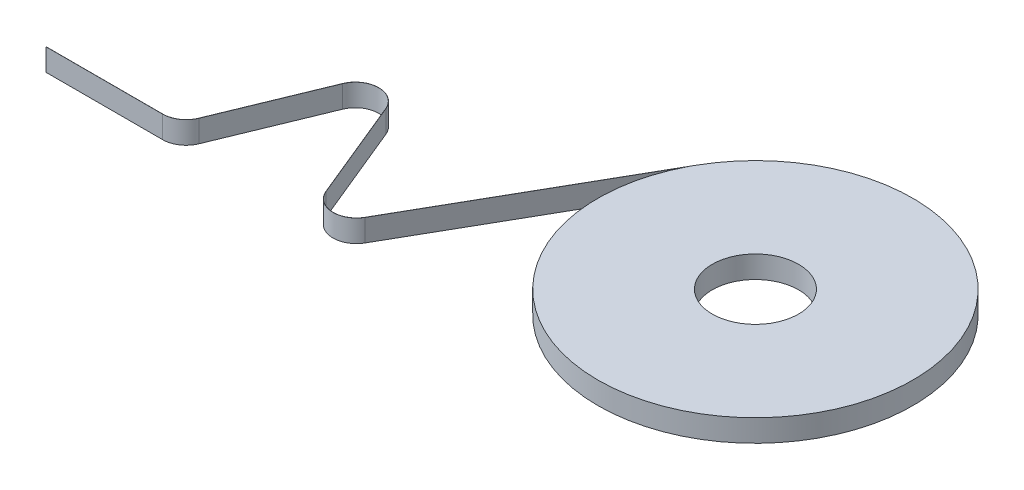
ISO-10303-21;
HEADER;
FILE_DESCRIPTION(('STEP AP214'),'2;1');
FILE_NAME('part.step','',(''),(''),'','','');
FILE_SCHEMA(('AUTOMOTIVE_DESIGN { 1 0 10303 214 1 1 1 1 }'));
ENDSEC;
DATA;
#1=APPLICATION_CONTEXT('core data for automotive mechanical design processes');
#2=APPLICATION_PROTOCOL_DEFINITION('international standard','automotive_design',2000,#1);
#3=PRODUCT_CONTEXT('',#1,'mechanical');
#4=PRODUCT('Part','Part','',(#3));
#5=PRODUCT_RELATED_PRODUCT_CATEGORY('part','',(#4));
#6=PRODUCT_DEFINITION_FORMATION('','',#4);
#7=PRODUCT_DEFINITION_CONTEXT('part definition',#1,'design');
#8=PRODUCT_DEFINITION('design','',#6,#7);
#9=PRODUCT_DEFINITION_SHAPE('','',#8);
#10=(LENGTH_UNIT() NAMED_UNIT(*) SI_UNIT(.MILLI.,.METRE.));
#11=(NAMED_UNIT(*) PLANE_ANGLE_UNIT() SI_UNIT($,.RADIAN.));
#12=(NAMED_UNIT(*) SI_UNIT($,.STERADIAN.) SOLID_ANGLE_UNIT());
#13=UNCERTAINTY_MEASURE_WITH_UNIT(LENGTH_MEASURE(1.E-05),#10,'distance_accuracy_value','');
#14=(GEOMETRIC_REPRESENTATION_CONTEXT(3) GLOBAL_UNCERTAINTY_ASSIGNED_CONTEXT((#13)) GLOBAL_UNIT_ASSIGNED_CONTEXT((#10,
#11,#12)) REPRESENTATION_CONTEXT('',''));
#15=CARTESIAN_POINT('',(0.,0.,0.));
#16=DIRECTION('',(0.,0.,1.));
#17=DIRECTION('',(1.,0.,0.));
#18=AXIS2_PLACEMENT_3D('',#15,#16,#17);
#19=CARTESIAN_POINT('',(-484.,0.,124.));
#20=DIRECTION('',(-1.,0.,0.));
#21=DIRECTION('',(0.,0.,1.));
#22=AXIS2_PLACEMENT_3D('',#19,#20,#21);
#23=PLANE('',#22);
#24=DIRECTION('',(0.,1.,0.));
#25=VECTOR('',#24,1.);
#26=CARTESIAN_POINT('',(-484.,0.,124.1));
#27=LINE('',#26,#25);
#28=CARTESIAN_POINT('',(-484.,0.,124.1));
#29=VERTEX_POINT('',#28);
#30=CARTESIAN_POINT('',(-484.,19.,124.1));
#31=VERTEX_POINT('',#30);
#32=EDGE_CURVE('E164',#29,#31,#27,.T.);
#33=ORIENTED_EDGE('',*,*,#32,.T.);
#34=DIRECTION('',(0.,0.,1.));
#35=VECTOR('',#34,1.);
#36=CARTESIAN_POINT('',(-484.,19.,0.));
#37=LINE('',#36,#35);
#38=CARTESIAN_POINT('',(-484.,19.,124.));
#39=VERTEX_POINT('',#38);
#40=EDGE_CURVE('E149',#39,#31,#37,.T.);
#41=ORIENTED_EDGE('',*,*,#40,.F.);
#42=DIRECTION('',(0.,1.,0.));
#43=VECTOR('',#42,1.);
#44=CARTESIAN_POINT('',(-484.,0.,124.));
#45=LINE('',#44,#43);
#46=CARTESIAN_POINT('',(-484.,0.,124.));
#47=VERTEX_POINT('',#46);
#48=EDGE_CURVE('E179',#47,#39,#45,.T.);
#49=ORIENTED_EDGE('',*,*,#48,.F.);
#50=DIRECTION('',(0.,0.,1.));
#51=VECTOR('',#50,1.);
#52=CARTESIAN_POINT('',(-484.,0.,124.));
#53=LINE('',#52,#51);
#54=EDGE_CURVE('E169',#47,#29,#53,.T.);
#55=ORIENTED_EDGE('',*,*,#54,.T.);
#56=EDGE_LOOP('',(#33,#41,#49,#55));
#57=FACE_BOUND('',#56,.T.);
#58=ADVANCED_FACE('F18',(#57),#23,.T.);
#59=CARTESIAN_POINT('',(0.,19.,0.));
#60=DIRECTION('',(0.,1.,0.));
#61=DIRECTION('',(0.,0.,1.));
#62=AXIS2_PLACEMENT_3D('',#59,#60,#61);
#63=PLANE('',#62);
#64=CARTESIAN_POINT('',(0.,19.,0.));
#65=DIRECTION('',(0.,-1.,0.));
#66=DIRECTION('',(0.,0.,-1.));
#67=AXIS2_PLACEMENT_3D('',#64,#65,#66);
#68=CIRCLE('',#67,37.);
#69=CARTESIAN_POINT('',(0.,19.,-37.));
#70=VERTEX_POINT('',#69);
#71=EDGE_CURVE('E212',#70,#70,#68,.T.);
#72=ORIENTED_EDGE('',*,*,#71,.T.);
#73=EDGE_LOOP('',(#72));
#74=FACE_BOUND('',#73,.T.);
#75=DIRECTION('',(-0.496319822885845,0.,0.868139754538728));
#76=VECTOR('',#75,1.);
#77=CARTESIAN_POINT('',(-117.112052887,19.,-66.9535441074));
#78=LINE('',#77,#76);
#79=CARTESIAN_POINT('',(-220.550390933557,19.,113.976028440191));
#80=VERTEX_POINT('',#79);
#81=CARTESIAN_POINT('',(-119.6905287103,19.,-62.4433930616273));
#82=VERTEX_POINT('',#81);
#83=EDGE_CURVE('E150',#80,#82,#78,.F.);
#84=ORIENTED_EDGE('',*,*,#83,.T.);
#85=CARTESIAN_POINT('',(0.,19.,0.));
#86=DIRECTION('',(0.,1.,0.));
#87=DIRECTION('',(0.,0.,1.));
#88=AXIS2_PLACEMENT_3D('',#85,#86,#87);
#89=CIRCLE('',#88,135.);
#90=CARTESIAN_POINT('',(-117.198866862864,19.,-67.0031760895945));
#91=VERTEX_POINT('',#90);
#92=EDGE_CURVE('E216',#91,#82,#89,.F.);
#93=ORIENTED_EDGE('',*,*,#92,.F.);
#94=DIRECTION('',(-0.496319822885845,0.,0.868139754538728));
#95=VECTOR('',#94,1.);
#96=CARTESIAN_POINT('',(-117.198866863,19.,-67.0031760896));
#97=LINE('',#96,#95);
#98=CARTESIAN_POINT('',(-220.637204909325,19.,113.926396457737));
#99=VERTEX_POINT('',#98);
#100=EDGE_CURVE('E120',#99,#91,#97,.F.);
#101=ORIENTED_EDGE('',*,*,#100,.F.);
#102=CARTESIAN_POINT('',(-238.,19.,104.));
#103=DIRECTION('',(0.,1.,0.));
#104=DIRECTION('',(0.,0.,1.));
#105=AXIS2_PLACEMENT_3D('',#102,#103,#104);
#106=CIRCLE('',#105,20.);
#107=CARTESIAN_POINT('',(-256.496103457938,19.,111.608820991151));
#108=VERTEX_POINT('',#107);
#109=EDGE_CURVE('E21',#99,#108,#106,.F.);
#110=ORIENTED_EDGE('',*,*,#109,.T.);
#111=DIRECTION('',(-0.380441049564131,0.,-0.924805172891319));
#112=VECTOR('',#111,1.);
#113=CARTESIAN_POINT('',(-256.496103458,19.,111.608820991));
#114=LINE('',#113,#112);
#115=CARTESIAN_POINT('',(-292.411416024924,19.,24.303134903773));
#116=VERTEX_POINT('',#115);
#117=EDGE_CURVE('E125',#116,#108,#114,.F.);
#118=ORIENTED_EDGE('',*,*,#117,.F.);
#119=CARTESIAN_POINT('',(-311.,19.,31.95));
#120=DIRECTION('',(0.,1.,0.));
#121=DIRECTION('',(0.,0.,1.));
#122=AXIS2_PLACEMENT_3D('',#119,#120,#121);
#123=CIRCLE('',#122,20.1);
#124=CARTESIAN_POINT('',(-329.588583975002,19.,24.3031349038036));
#125=VERTEX_POINT('',#124);
#126=EDGE_CURVE('E228',#125,#116,#123,.F.);
#127=ORIENTED_EDGE('',*,*,#126,.F.);
#128=DIRECTION('',(-0.380441049564131,0.,0.924805172891319));
#129=VECTOR('',#128,1.);
#130=CARTESIAN_POINT('',(-329.588583975,19.,24.3031349038));
#131=LINE('',#130,#129);
#132=CARTESIAN_POINT('',(-365.503896542069,19.,111.608820991149));
#133=VERTEX_POINT('',#132);
#134=EDGE_CURVE('E182',#133,#125,#131,.F.);
#135=ORIENTED_EDGE('',*,*,#134,.F.);
#136=CARTESIAN_POINT('',(-384.,19.,104.));
#137=DIRECTION('',(0.,1.,0.));
#138=DIRECTION('',(0.,0.,1.));
#139=AXIS2_PLACEMENT_3D('',#136,#137,#138);
#140=CIRCLE('',#139,20.);
#141=CARTESIAN_POINT('',(-384.,19.,124.));
#142=VERTEX_POINT('',#141);
#143=EDGE_CURVE('E226',#133,#142,#140,.F.);
#144=ORIENTED_EDGE('',*,*,#143,.T.);
#145=DIRECTION('',(-1.,0.,0.));
#146=VECTOR('',#145,1.);
#147=CARTESIAN_POINT('',(-384.,19.,124.));
#148=LINE('',#147,#146);
#149=EDGE_CURVE('E176',#39,#142,#148,.F.);
#150=ORIENTED_EDGE('',*,*,#149,.F.);
#151=ORIENTED_EDGE('',*,*,#40,.T.);
#152=DIRECTION('',(-1.,0.,0.));
#153=VECTOR('',#152,1.);
#154=CARTESIAN_POINT('',(-384.,19.,124.1));
#155=LINE('',#154,#153);
#156=CARTESIAN_POINT('',(-384.,19.,124.1));
#157=VERTEX_POINT('',#156);
#158=EDGE_CURVE('E161',#31,#157,#155,.F.);
#159=ORIENTED_EDGE('',*,*,#158,.T.);
#160=CARTESIAN_POINT('',(-384.,19.,104.));
#161=DIRECTION('',(0.,1.,0.));
#162=DIRECTION('',(0.,0.,1.));
#163=AXIS2_PLACEMENT_3D('',#160,#161,#162);
#164=CIRCLE('',#163,20.1);
#165=CARTESIAN_POINT('',(-365.411416025033,19.,111.646865096082));
#166=VERTEX_POINT('',#165);
#167=EDGE_CURVE('E223',#166,#157,#164,.F.);
#168=ORIENTED_EDGE('',*,*,#167,.F.);
#169=DIRECTION('',(-0.380441049564131,0.,0.924805172891319));
#170=VECTOR('',#169,1.);
#171=CARTESIAN_POINT('',(-329.496103458,19.,24.3411790087));
#172=LINE('',#171,#170);
#173=CARTESIAN_POINT('',(-329.496103457913,19.,24.3411790087087));
#174=VERTEX_POINT('',#173);
#175=EDGE_CURVE('E157',#166,#174,#172,.F.);
#176=ORIENTED_EDGE('',*,*,#175,.T.);
#177=CARTESIAN_POINT('',(-311.,19.,31.95));
#178=DIRECTION('',(0.,1.,0.));
#179=DIRECTION('',(0.,0.,1.));
#180=AXIS2_PLACEMENT_3D('',#177,#178,#179);
#181=CIRCLE('',#180,20.);
#182=CARTESIAN_POINT('',(-292.503896542008,19.,24.3411790086764));
#183=VERTEX_POINT('',#182);
#184=EDGE_CURVE('E221',#174,#183,#181,.F.);
#185=ORIENTED_EDGE('',*,*,#184,.T.);
#186=DIRECTION('',(-0.380441049564131,0.,-0.924805172891319));
#187=VECTOR('',#186,1.);
#188=CARTESIAN_POINT('',(-256.588583975,19.,111.646865096));
#189=LINE('',#188,#187);
#190=CARTESIAN_POINT('',(-256.588583975058,19.,111.64686509612));
#191=VERTEX_POINT('',#190);
#192=EDGE_CURVE('E153',#183,#191,#189,.F.);
#193=ORIENTED_EDGE('',*,*,#192,.T.);
#194=CARTESIAN_POINT('',(-238.,19.,104.));
#195=DIRECTION('',(0.,1.,0.));
#196=DIRECTION('',(0.,0.,1.));
#197=AXIS2_PLACEMENT_3D('',#194,#195,#196);
#198=CIRCLE('',#197,20.1);
#199=EDGE_CURVE('E218',#80,#191,#198,.F.);
#200=ORIENTED_EDGE('',*,*,#199,.F.);
#201=EDGE_LOOP('',(#84,#93,#101,#110,#118,#127,#135,#144,#150,#151,#159,#168,#176,#185,#193,#200));
#202=FACE_BOUND('',#201,.T.);
#203=ADVANCED_FACE('F124',(#74,#202),#63,.T.);
#204=CARTESIAN_POINT('',(-117.198866863,0.,-67.0031760896));
#205=DIRECTION('',(-0.868139754538728,0.,-0.496319822885845));
#206=DIRECTION('',(-0.496319822885845,0.,0.868139754538728));
#207=AXIS2_PLACEMENT_3D('',#204,#205,#206);
#208=PLANE('',#207);
#209=DIRECTION('',(0.,1.,0.));
#210=VECTOR('',#209,1.);
#211=CARTESIAN_POINT('',(-220.637204909292,9.5,113.926396457833));
#212=LINE('',#211,#210);
#213=CARTESIAN_POINT('',(-220.637204909101,0.,113.926396457838));
#214=VERTEX_POINT('',#213);
#215=EDGE_CURVE('E131',#214,#99,#212,.T.);
#216=ORIENTED_EDGE('',*,*,#215,.T.);
#217=ORIENTED_EDGE('',*,*,#100,.T.);
#218=DIRECTION('',(0.,1.,0.));
#219=VECTOR('',#218,1.);
#220=CARTESIAN_POINT('',(-117.198866862791,9.5,-67.0031760894803));
#221=LINE('',#220,#219);
#222=CARTESIAN_POINT('',(-117.198866862943,0.,-67.0031760894573));
#223=VERTEX_POINT('',#222);
#224=EDGE_CURVE('E215',#223,#91,#221,.T.);
#225=ORIENTED_EDGE('',*,*,#224,.F.);
#226=DIRECTION('',(-0.496319822883812,0.,0.868139754539891));
#227=VECTOR('',#226,1.);
#228=CARTESIAN_POINT('',(-117.198866863,0.,-67.0031760896));
#229=LINE('',#228,#227);
#230=EDGE_CURVE('E211',#223,#214,#229,.T.);
#231=ORIENTED_EDGE('',*,*,#230,.T.);
#232=EDGE_LOOP('',(#216,#217,#225,#231));
#233=FACE_BOUND('',#232,.T.);
#234=ADVANCED_FACE('F462',(#233),#208,.T.);
#235=CARTESIAN_POINT('',(-238.,9.5,104.));
#236=DIRECTION('',(0.,1.,0.));
#237=DIRECTION('',(0.,0.,1.));
#238=AXIS2_PLACEMENT_3D('',#235,#236,#237);
#239=CYLINDRICAL_SURFACE('',#238,20.);
#240=ORIENTED_EDGE('',*,*,#215,.F.);
#241=CARTESIAN_POINT('',(-238.,0.,104.));
#242=DIRECTION('',(0.,1.,0.));
#243=DIRECTION('',(0.,0.,1.));
#244=AXIS2_PLACEMENT_3D('',#241,#242,#243);
#245=CIRCLE('',#244,20.);
#246=CARTESIAN_POINT('',(-256.496103457936,0.,111.608820991155));
#247=VERTEX_POINT('',#246);
#248=EDGE_CURVE('E142',#214,#247,#245,.F.);
#249=ORIENTED_EDGE('',*,*,#248,.T.);
#250=DIRECTION('',(0.,1.,0.));
#251=VECTOR('',#250,1.);
#252=CARTESIAN_POINT('',(-256.496103458,0.,111.608820991));
#253=LINE('',#252,#251);
#254=EDGE_CURVE('E130',#108,#247,#253,.F.);
#255=ORIENTED_EDGE('',*,*,#254,.F.);
#256=ORIENTED_EDGE('',*,*,#109,.F.);
#257=EDGE_LOOP('',(#240,#249,#255,#256));
#258=FACE_BOUND('',#257,.T.);
#259=ADVANCED_FACE('F140',(#258),#239,.F.);
#260=CARTESIAN_POINT('',(-256.496103458,0.,111.608820991));
#261=DIRECTION('',(0.924805172891319,0.,-0.380441049564131));
#262=DIRECTION('',(-0.380441049564131,0.,-0.924805172891319));
#263=AXIS2_PLACEMENT_3D('',#260,#261,#262);
#264=PLANE('',#263);
#265=DIRECTION('',(0.,1.,0.));
#266=VECTOR('',#265,1.);
#267=CARTESIAN_POINT('',(-292.411416024887,9.5,24.3031349037537));
#268=LINE('',#267,#266);
#269=CARTESIAN_POINT('',(-292.411416024944,0.,24.3031349037766));
#270=VERTEX_POINT('',#269);
#271=EDGE_CURVE('E137',#116,#270,#268,.F.);
#272=ORIENTED_EDGE('',*,*,#271,.F.);
#273=ORIENTED_EDGE('',*,*,#117,.T.);
#274=ORIENTED_EDGE('',*,*,#254,.T.);
#275=DIRECTION('',(-0.380441049564516,0.,-0.924805172891161));
#276=VECTOR('',#275,1.);
#277=CARTESIAN_POINT('',(-256.496103458,0.,111.608820991));
#278=LINE('',#277,#276);
#279=EDGE_CURVE('E209',#247,#270,#278,.T.);
#280=ORIENTED_EDGE('',*,*,#279,.T.);
#281=EDGE_LOOP('',(#272,#273,#274,#280));
#282=FACE_BOUND('',#281,.T.);
#283=ADVANCED_FACE('F134',(#282),#264,.T.);
#284=CARTESIAN_POINT('',(-311.,9.5,31.95));
#285=DIRECTION('',(0.,1.,0.));
#286=DIRECTION('',(0.,0.,1.));
#287=AXIS2_PLACEMENT_3D('',#284,#285,#286);
#288=CYLINDRICAL_SURFACE('',#287,20.1);
#289=DIRECTION('',(0.,1.,0.));
#290=VECTOR('',#289,1.);
#291=CARTESIAN_POINT('',(-329.588583975,0.,24.3031349038));
#292=LINE('',#291,#290);
#293=CARTESIAN_POINT('',(-329.588583975,0.,24.3031349037998));
#294=VERTEX_POINT('',#293);
#295=EDGE_CURVE('E185',#125,#294,#292,.F.);
#296=ORIENTED_EDGE('',*,*,#295,.F.);
#297=ORIENTED_EDGE('',*,*,#126,.T.);
#298=ORIENTED_EDGE('',*,*,#271,.T.);
#299=CARTESIAN_POINT('',(-311.,0.,31.95));
#300=DIRECTION('',(0.,1.,0.));
#301=DIRECTION('',(0.,0.,1.));
#302=AXIS2_PLACEMENT_3D('',#299,#300,#301);
#303=CIRCLE('',#302,20.1);
#304=EDGE_CURVE('E206',#270,#294,#303,.T.);
#305=ORIENTED_EDGE('',*,*,#304,.T.);
#306=EDGE_LOOP('',(#296,#297,#298,#305));
#307=FACE_BOUND('',#306,.T.);
#308=ADVANCED_FACE('F232',(#307),#288,.T.);
#309=CARTESIAN_POINT('',(-329.588583975,0.,24.3031349038));
#310=DIRECTION('',(-0.924805172891319,0.,-0.380441049564131));
#311=DIRECTION('',(-0.380441049564131,0.,0.924805172891319));
#312=AXIS2_PLACEMENT_3D('',#309,#310,#311);
#313=PLANE('',#312);
#314=DIRECTION('',(0.,1.,0.));
#315=VECTOR('',#314,1.);
#316=CARTESIAN_POINT('',(-365.503896542049,9.5,111.60882099098));
#317=LINE('',#316,#315);
#318=CARTESIAN_POINT('',(-365.503896542088,0.,111.608820991145));
#319=VERTEX_POINT('',#318);
#320=EDGE_CURVE('E184',#319,#133,#317,.T.);
#321=ORIENTED_EDGE('',*,*,#320,.T.);
#322=ORIENTED_EDGE('',*,*,#134,.T.);
#323=ORIENTED_EDGE('',*,*,#295,.T.);
#324=DIRECTION('',(-0.380441049564516,0.,0.924805172891161));
#325=VECTOR('',#324,1.);
#326=CARTESIAN_POINT('',(-329.588583975,0.,24.3031349038));
#327=LINE('',#326,#325);
#328=EDGE_CURVE('E205',#294,#319,#327,.T.);
#329=ORIENTED_EDGE('',*,*,#328,.T.);
#330=EDGE_LOOP('',(#321,#322,#323,#329));
#331=FACE_BOUND('',#330,.T.);
#332=ADVANCED_FACE('F269',(#331),#313,.T.);
#333=CARTESIAN_POINT('',(-384.,9.5,104.));
#334=DIRECTION('',(0.,1.,0.));
#335=DIRECTION('',(0.,0.,1.));
#336=AXIS2_PLACEMENT_3D('',#333,#334,#335);
#337=CYLINDRICAL_SURFACE('',#336,20.);
#338=ORIENTED_EDGE('',*,*,#320,.F.);
#339=CARTESIAN_POINT('',(-384.,0.,104.));
#340=DIRECTION('',(0.,1.,0.));
#341=DIRECTION('',(0.,0.,1.));
#342=AXIS2_PLACEMENT_3D('',#339,#340,#341);
#343=CIRCLE('',#342,20.);
#344=CARTESIAN_POINT('',(-384.,0.,124.));
#345=VERTEX_POINT('',#344);
#346=EDGE_CURVE('E201',#319,#345,#343,.F.);
#347=ORIENTED_EDGE('',*,*,#346,.T.);
#348=DIRECTION('',(0.,1.,0.));
#349=VECTOR('',#348,1.);
#350=CARTESIAN_POINT('',(-384.,0.,124.));
#351=LINE('',#350,#349);
#352=EDGE_CURVE('E227',#142,#345,#351,.F.);
#353=ORIENTED_EDGE('',*,*,#352,.F.);
#354=ORIENTED_EDGE('',*,*,#143,.F.);
#355=EDGE_LOOP('',(#338,#347,#353,#354));
#356=FACE_BOUND('',#355,.T.);
#357=ADVANCED_FACE('F272',(#356),#337,.F.);
#358=CARTESIAN_POINT('',(-384.,0.,124.));
#359=DIRECTION('',(0.,0.,-1.));
#360=DIRECTION('',(-1.,0.,0.));
#361=AXIS2_PLACEMENT_3D('',#358,#359,#360);
#362=PLANE('',#361);
#363=ORIENTED_EDGE('',*,*,#48,.T.);
#364=ORIENTED_EDGE('',*,*,#149,.T.);
#365=ORIENTED_EDGE('',*,*,#352,.T.);
#366=DIRECTION('',(1.,0.,0.));
#367=VECTOR('',#366,1.);
#368=CARTESIAN_POINT('',(0.,0.,124.));
#369=LINE('',#368,#367);
#370=EDGE_CURVE('E204',#345,#47,#369,.F.);
#371=ORIENTED_EDGE('',*,*,#370,.T.);
#372=EDGE_LOOP('',(#363,#364,#365,#371));
#373=FACE_BOUND('',#372,.T.);
#374=ADVANCED_FACE('F326',(#373),#362,.T.);
#375=CARTESIAN_POINT('',(-384.,0.,124.1));
#376=DIRECTION('',(0.,0.,-1.));
#377=DIRECTION('',(-1.,0.,0.));
#378=AXIS2_PLACEMENT_3D('',#375,#376,#377);
#379=PLANE('',#378);
#380=ORIENTED_EDGE('',*,*,#32,.F.);
#381=DIRECTION('',(1.,0.,0.));
#382=VECTOR('',#381,1.);
#383=CARTESIAN_POINT('',(0.,0.,124.1));
#384=LINE('',#383,#382);
#385=CARTESIAN_POINT('',(-384.,0.,124.1));
#386=VERTEX_POINT('',#385);
#387=EDGE_CURVE('E200',#29,#386,#384,.T.);
#388=ORIENTED_EDGE('',*,*,#387,.T.);
#389=DIRECTION('',(0.,1.,0.));
#390=VECTOR('',#389,1.);
#391=CARTESIAN_POINT('',(-384.,9.5,124.1));
#392=LINE('',#391,#390);
#393=EDGE_CURVE('E163',#157,#386,#392,.F.);
#394=ORIENTED_EDGE('',*,*,#393,.F.);
#395=ORIENTED_EDGE('',*,*,#158,.F.);
#396=EDGE_LOOP('',(#380,#388,#394,#395));
#397=FACE_BOUND('',#396,.T.);
#398=ADVANCED_FACE('F319',(#397),#379,.F.);
#399=CARTESIAN_POINT('',(-384.,9.5,104.));
#400=DIRECTION('',(0.,1.,0.));
#401=DIRECTION('',(0.,0.,1.));
#402=AXIS2_PLACEMENT_3D('',#399,#400,#401);
#403=CYLINDRICAL_SURFACE('',#402,20.1);
#404=DIRECTION('',(0.,1.,0.));
#405=VECTOR('',#404,1.);
#406=CARTESIAN_POINT('',(-365.411416024999,0.,111.646865096));
#407=LINE('',#406,#405);
#408=CARTESIAN_POINT('',(-365.411416025033,0.,111.646865096082));
#409=VERTEX_POINT('',#408);
#410=EDGE_CURVE('E160',#409,#166,#407,.T.);
#411=ORIENTED_EDGE('',*,*,#410,.T.);
#412=ORIENTED_EDGE('',*,*,#167,.T.);
#413=ORIENTED_EDGE('',*,*,#393,.T.);
#414=CARTESIAN_POINT('',(-384.,0.,104.));
#415=DIRECTION('',(0.,1.,0.));
#416=DIRECTION('',(0.,0.,1.));
#417=AXIS2_PLACEMENT_3D('',#414,#415,#416);
#418=CIRCLE('',#417,20.1);
#419=EDGE_CURVE('E197',#386,#409,#418,.T.);
#420=ORIENTED_EDGE('',*,*,#419,.T.);
#421=EDGE_LOOP('',(#411,#412,#413,#420));
#422=FACE_BOUND('',#421,.T.);
#423=ADVANCED_FACE('F314',(#422),#403,.T.);
#424=CARTESIAN_POINT('',(-329.496103458,0.,24.3411790087));
#425=DIRECTION('',(-0.924805172891319,0.,-0.380441049564131));
#426=DIRECTION('',(-0.380441049564131,0.,0.924805172891319));
#427=AXIS2_PLACEMENT_3D('',#424,#425,#426);
#428=PLANE('',#427);
#429=ORIENTED_EDGE('',*,*,#410,.F.);
#430=DIRECTION('',(0.380441049564143,0.,-0.924805172891314));
#431=VECTOR('',#430,1.);
#432=CARTESIAN_POINT('',(-365.411416025,0.,111.646865096));
#433=LINE('',#432,#431);
#434=CARTESIAN_POINT('',(-329.496103457913,0.,24.3411790087086));
#435=VERTEX_POINT('',#434);
#436=EDGE_CURVE('E196',#409,#435,#433,.T.);
#437=ORIENTED_EDGE('',*,*,#436,.T.);
#438=DIRECTION('',(0.,1.,0.));
#439=VECTOR('',#438,1.);
#440=CARTESIAN_POINT('',(-329.496103457845,9.5,24.3411790087636));
#441=LINE('',#440,#439);
#442=EDGE_CURVE('E159',#435,#174,#441,.T.);
#443=ORIENTED_EDGE('',*,*,#442,.T.);
#444=ORIENTED_EDGE('',*,*,#175,.F.);
#445=EDGE_LOOP('',(#429,#437,#443,#444));
#446=FACE_BOUND('',#445,.T.);
#447=ADVANCED_FACE('F311',(#446),#428,.F.);
#448=CARTESIAN_POINT('',(-311.,9.5,31.95));
#449=DIRECTION('',(0.,1.,0.));
#450=DIRECTION('',(0.,0.,1.));
#451=AXIS2_PLACEMENT_3D('',#448,#449,#450);
#452=CYLINDRICAL_SURFACE('',#451,20.);
#453=ORIENTED_EDGE('',*,*,#442,.F.);
#454=CARTESIAN_POINT('',(-311.,0.,31.95));
#455=DIRECTION('',(0.,1.,0.));
#456=DIRECTION('',(0.,0.,1.));
#457=AXIS2_PLACEMENT_3D('',#454,#455,#456);
#458=CIRCLE('',#457,20.);
#459=CARTESIAN_POINT('',(-292.503896542009,0.,24.3411790086765));
#460=VERTEX_POINT('',#459);
#461=EDGE_CURVE('E193',#435,#460,#458,.F.);
#462=ORIENTED_EDGE('',*,*,#461,.T.);
#463=DIRECTION('',(0.,1.,0.));
#464=VECTOR('',#463,1.);
#465=CARTESIAN_POINT('',(-292.503896541999,0.,24.3411790086995));
#466=LINE('',#465,#464);
#467=EDGE_CURVE('E156',#460,#183,#466,.T.);
#468=ORIENTED_EDGE('',*,*,#467,.T.);
#469=ORIENTED_EDGE('',*,*,#184,.F.);
#470=EDGE_LOOP('',(#453,#462,#468,#469));
#471=FACE_BOUND('',#470,.T.);
#472=ADVANCED_FACE('F307',(#471),#452,.F.);
#473=CARTESIAN_POINT('',(-256.588583975,0.,111.646865096));
#474=DIRECTION('',(0.924805172891319,0.,-0.380441049564131));
#475=DIRECTION('',(-0.380441049564131,0.,-0.924805172891319));
#476=AXIS2_PLACEMENT_3D('',#473,#474,#475);
#477=PLANE('',#476);
#478=ORIENTED_EDGE('',*,*,#467,.F.);
#479=DIRECTION('',(0.380441049564143,0.,0.924805172891314));
#480=VECTOR('',#479,1.);
#481=CARTESIAN_POINT('',(-292.503896542,0.,24.3411790087));
#482=LINE('',#481,#480);
#483=CARTESIAN_POINT('',(-256.588583975058,0.,111.64686509612));
#484=VERTEX_POINT('',#483);
#485=EDGE_CURVE('E192',#460,#484,#482,.T.);
#486=ORIENTED_EDGE('',*,*,#485,.T.);
#487=DIRECTION('',(0.,1.,0.));
#488=VECTOR('',#487,1.);
#489=CARTESIAN_POINT('',(-256.588583975183,9.5,111.646865096075));
#490=LINE('',#489,#488);
#491=EDGE_CURVE('E155',#191,#484,#490,.F.);
#492=ORIENTED_EDGE('',*,*,#491,.F.);
#493=ORIENTED_EDGE('',*,*,#192,.F.);
#494=EDGE_LOOP('',(#478,#486,#492,#493));
#495=FACE_BOUND('',#494,.T.);
#496=ADVANCED_FACE('F303',(#495),#477,.F.);
#497=CARTESIAN_POINT('',(-238.,9.5,104.));
#498=DIRECTION('',(0.,1.,0.));
#499=DIRECTION('',(0.,0.,1.));
#500=AXIS2_PLACEMENT_3D('',#497,#498,#499);
#501=CYLINDRICAL_SURFACE('',#500,20.1);
#502=DIRECTION('',(0.,1.,0.));
#503=VECTOR('',#502,1.);
#504=CARTESIAN_POINT('',(-220.550390933584,0.,113.976028440238));
#505=LINE('',#504,#503);
#506=CARTESIAN_POINT('',(-220.550390933776,0.,113.97602844009));
#507=VERTEX_POINT('',#506);
#508=EDGE_CURVE('E152',#507,#80,#505,.T.);
#509=ORIENTED_EDGE('',*,*,#508,.T.);
#510=ORIENTED_EDGE('',*,*,#199,.T.);
#511=ORIENTED_EDGE('',*,*,#491,.T.);
#512=CARTESIAN_POINT('',(-238.,0.,104.));
#513=DIRECTION('',(0.,1.,0.));
#514=DIRECTION('',(0.,0.,1.));
#515=AXIS2_PLACEMENT_3D('',#512,#513,#514);
#516=CIRCLE('',#515,20.1);
#517=EDGE_CURVE('E189',#484,#507,#516,.T.);
#518=ORIENTED_EDGE('',*,*,#517,.T.);
#519=EDGE_LOOP('',(#509,#510,#511,#518));
#520=FACE_BOUND('',#519,.T.);
#521=ADVANCED_FACE('F299',(#520),#501,.T.);
#522=CARTESIAN_POINT('',(-117.112052887,0.,-66.9535441074));
#523=DIRECTION('',(-0.868139754538728,0.,-0.496319822885845));
#524=DIRECTION('',(-0.496319822885845,0.,0.868139754538728));
#525=AXIS2_PLACEMENT_3D('',#522,#523,#524);
#526=PLANE('',#525);
#527=ORIENTED_EDGE('',*,*,#83,.F.);
#528=ORIENTED_EDGE('',*,*,#508,.F.);
#529=DIRECTION('',(0.496319822887691,0.,-0.868139754537673));
#530=VECTOR('',#529,1.);
#531=CARTESIAN_POINT('',(-220.550390934,0.,113.97602844));
#532=LINE('',#531,#530);
#533=CARTESIAN_POINT('',(-119.690528710016,0.,-62.4433930621707));
#534=VERTEX_POINT('',#533);
#535=EDGE_CURVE('E188',#507,#534,#532,.T.);
#536=ORIENTED_EDGE('',*,*,#535,.T.);
#537=DIRECTION('',(0.,1.,0.));
#538=VECTOR('',#537,1.);
#539=CARTESIAN_POINT('',(-119.690528709131,9.5,-62.4433930638683));
#540=LINE('',#539,#538);
#541=EDGE_CURVE('E36',#82,#534,#540,.F.);
#542=ORIENTED_EDGE('',*,*,#541,.F.);
#543=EDGE_LOOP('',(#527,#528,#536,#542));
#544=FACE_BOUND('',#543,.T.);
#545=ADVANCED_FACE('F295',(#544),#526,.F.);
#546=CARTESIAN_POINT('',(0.,9.5,0.));
#547=DIRECTION('',(0.,1.,0.));
#548=DIRECTION('',(0.,0.,1.));
#549=AXIS2_PLACEMENT_3D('',#546,#547,#548);
#550=CYLINDRICAL_SURFACE('',#549,135.);
#551=CARTESIAN_POINT('',(0.,0.,0.));
#552=DIRECTION('',(0.,1.,0.));
#553=DIRECTION('',(0.,0.,1.));
#554=AXIS2_PLACEMENT_3D('',#551,#552,#553);
#555=CIRCLE('',#554,135.);
#556=EDGE_CURVE('E27',#534,#223,#555,.T.);
#557=ORIENTED_EDGE('',*,*,#556,.T.);
#558=ORIENTED_EDGE('',*,*,#224,.T.);
#559=ORIENTED_EDGE('',*,*,#92,.T.);
#560=ORIENTED_EDGE('',*,*,#541,.T.);
#561=EDGE_LOOP('',(#557,#558,#559,#560));
#562=FACE_BOUND('',#561,.T.);
#563=ADVANCED_FACE('F343',(#562),#550,.T.);
#564=CARTESIAN_POINT('',(0.,18.9,0.));
#565=DIRECTION('',(0.,-1.,0.));
#566=DIRECTION('',(0.,0.,-1.));
#567=AXIS2_PLACEMENT_3D('',#564,#565,#566);
#568=CYLINDRICAL_SURFACE('',#567,37.);
#569=CARTESIAN_POINT('',(0.,0.,0.));
#570=DIRECTION('',(0.,-1.,0.));
#571=DIRECTION('',(0.,0.,-1.));
#572=AXIS2_PLACEMENT_3D('',#569,#570,#571);
#573=CIRCLE('',#572,37.);
#574=CARTESIAN_POINT('',(0.,0.,-37.));
#575=VERTEX_POINT('',#574);
#576=EDGE_CURVE('E11',#575,#575,#573,.T.);
#577=ORIENTED_EDGE('',*,*,#576,.T.);
#578=EDGE_LOOP('',(#577));
#579=FACE_BOUND('',#578,.T.);
#580=ORIENTED_EDGE('',*,*,#71,.F.);
#581=EDGE_LOOP('',(#580));
#582=FACE_BOUND('',#581,.T.);
#583=ADVANCED_FACE('F337',(#579,#582),#568,.F.);
#584=CARTESIAN_POINT('',(0.,0.,0.));
#585=DIRECTION('',(0.,1.,0.));
#586=DIRECTION('',(0.,0.,1.));
#587=AXIS2_PLACEMENT_3D('',#584,#585,#586);
#588=PLANE('',#587);
#589=ORIENTED_EDGE('',*,*,#576,.F.);
#590=EDGE_LOOP('',(#589));
#591=FACE_BOUND('',#590,.T.);
#592=ORIENTED_EDGE('',*,*,#230,.F.);
#593=ORIENTED_EDGE('',*,*,#556,.F.);
#594=ORIENTED_EDGE('',*,*,#535,.F.);
#595=ORIENTED_EDGE('',*,*,#517,.F.);
#596=ORIENTED_EDGE('',*,*,#485,.F.);
#597=ORIENTED_EDGE('',*,*,#461,.F.);
#598=ORIENTED_EDGE('',*,*,#436,.F.);
#599=ORIENTED_EDGE('',*,*,#419,.F.);
#600=ORIENTED_EDGE('',*,*,#387,.F.);
#601=ORIENTED_EDGE('',*,*,#54,.F.);
#602=ORIENTED_EDGE('',*,*,#370,.F.);
#603=ORIENTED_EDGE('',*,*,#346,.F.);
#604=ORIENTED_EDGE('',*,*,#328,.F.);
#605=ORIENTED_EDGE('',*,*,#304,.F.);
#606=ORIENTED_EDGE('',*,*,#279,.F.);
#607=ORIENTED_EDGE('',*,*,#248,.F.);
#608=EDGE_LOOP('',(#592,#593,#594,#595,#596,#597,#598,#599,#600,#601,#602,#603,#604,#605,#606,#607));
#609=FACE_BOUND('',#608,.T.);
#610=ADVANCED_FACE('F236',(#591,#609),#588,.F.);
#611=CLOSED_SHELL('',(#58,#203,#234,#259,#283,#308,#332,#357,#374,#398,#423,#447,#472,#496,#521,
#545,#563,#583,#610));
#612=MANIFOLD_SOLID_BREP('B1',#611);
#613=ADVANCED_BREP_SHAPE_REPRESENTATION('',(#18,#612),#14);
#614=SHAPE_DEFINITION_REPRESENTATION(#9,#613);
ENDSEC;
END-ISO-10303-21;
